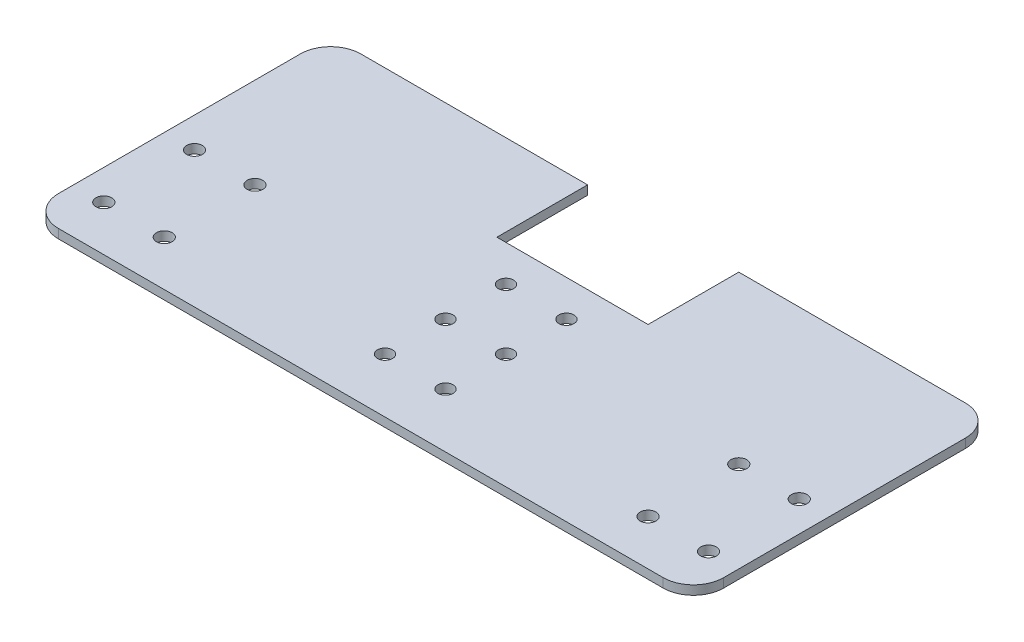
ISO-10303-21;
HEADER;
FILE_DESCRIPTION(('STEP AP214'),'2;1');
FILE_NAME('part.step','',(''),(''),'','','');
FILE_SCHEMA(('AUTOMOTIVE_DESIGN { 1 0 10303 214 1 1 1 1 }'));
ENDSEC;
DATA;
#1=APPLICATION_CONTEXT('core data for automotive mechanical design processes');
#2=APPLICATION_PROTOCOL_DEFINITION('international standard','automotive_design',2000,#1);
#3=PRODUCT_CONTEXT('',#1,'mechanical');
#4=PRODUCT('Part','Part','',(#3));
#5=PRODUCT_RELATED_PRODUCT_CATEGORY('part','',(#4));
#6=PRODUCT_DEFINITION_FORMATION('','',#4);
#7=PRODUCT_DEFINITION_CONTEXT('part definition',#1,'design');
#8=PRODUCT_DEFINITION('design','',#6,#7);
#9=PRODUCT_DEFINITION_SHAPE('','',#8);
#10=(LENGTH_UNIT() NAMED_UNIT(*) SI_UNIT(.MILLI.,.METRE.));
#11=(NAMED_UNIT(*) PLANE_ANGLE_UNIT() SI_UNIT($,.RADIAN.));
#12=(NAMED_UNIT(*) SI_UNIT($,.STERADIAN.) SOLID_ANGLE_UNIT());
#13=UNCERTAINTY_MEASURE_WITH_UNIT(LENGTH_MEASURE(1.E-05),#10,'distance_accuracy_value','');
#14=(GEOMETRIC_REPRESENTATION_CONTEXT(3) GLOBAL_UNCERTAINTY_ASSIGNED_CONTEXT((#13)) GLOBAL_UNIT_ASSIGNED_CONTEXT((#10,
#11,#12)) REPRESENTATION_CONTEXT('',''));
#15=CARTESIAN_POINT('',(0.,0.,0.));
#16=DIRECTION('',(0.,0.,1.));
#17=DIRECTION('',(1.,0.,0.));
#18=AXIS2_PLACEMENT_3D('',#15,#16,#17);
#19=CARTESIAN_POINT('',(-99.9999999999999,3.,-50.));
#20=DIRECTION('',(0.,0.,1.));
#21=DIRECTION('',(1.,0.,0.));
#22=AXIS2_PLACEMENT_3D('',#19,#20,#21);
#23=PLANE('',#22);
#24=DIRECTION('',(-1.,0.,0.));
#25=VECTOR('',#24,1.);
#26=CARTESIAN_POINT('',(-99.9999999999999,3.,-50.));
#27=LINE('',#26,#25);
#28=CARTESIAN_POINT('',(-25.,3.,-50.));
#29=VERTEX_POINT('',#28);
#30=CARTESIAN_POINT('',(-99.9999999999999,3.,-50.));
#31=VERTEX_POINT('',#30);
#32=EDGE_CURVE('E198',#29,#31,#27,.T.);
#33=ORIENTED_EDGE('',*,*,#32,.F.);
#34=DIRECTION('',(0.,1.,0.));
#35=VECTOR('',#34,1.);
#36=CARTESIAN_POINT('',(-25.,0.,-50.));
#37=LINE('',#36,#35);
#38=CARTESIAN_POINT('',(-25.,0.,-50.));
#39=VERTEX_POINT('',#38);
#40=EDGE_CURVE('E148',#39,#29,#37,.T.);
#41=ORIENTED_EDGE('',*,*,#40,.F.);
#42=DIRECTION('',(-1.,0.,0.));
#43=VECTOR('',#42,1.);
#44=CARTESIAN_POINT('',(-99.9999999999999,0.,-50.));
#45=LINE('',#44,#43);
#46=CARTESIAN_POINT('',(-99.9999999999999,0.,-50.));
#47=VERTEX_POINT('',#46);
#48=EDGE_CURVE('E147',#39,#47,#45,.T.);
#49=ORIENTED_EDGE('',*,*,#48,.T.);
#50=DIRECTION('',(0.,-1.,0.));
#51=VECTOR('',#50,1.);
#52=CARTESIAN_POINT('',(-99.9999999999999,3.,-50.));
#53=LINE('',#52,#51);
#54=EDGE_CURVE('E41',#31,#47,#53,.T.);
#55=ORIENTED_EDGE('',*,*,#54,.F.);
#56=EDGE_LOOP('',(#33,#41,#49,#55));
#57=FACE_BOUND('',#56,.T.);
#58=ADVANCED_FACE('F33',(#57),#23,.F.);
#59=CARTESIAN_POINT('',(100.,3.,-40.));
#60=DIRECTION('',(0.,-1.,0.));
#61=DIRECTION('',(0.,0.,-1.));
#62=AXIS2_PLACEMENT_3D('',#59,#60,#61);
#63=CYLINDRICAL_SURFACE('',#62,9.99999999999999);
#64=CARTESIAN_POINT('',(100.,0.,-40.));
#65=DIRECTION('',(0.,1.,0.));
#66=DIRECTION('',(0.,0.,-1.));
#67=AXIS2_PLACEMENT_3D('',#64,#65,#66);
#68=CIRCLE('',#67,9.99999999999999);
#69=CARTESIAN_POINT('',(110.,0.,-39.9999999999999));
#70=VERTEX_POINT('',#69);
#71=CARTESIAN_POINT('',(99.9999999999999,0.,-50.));
#72=VERTEX_POINT('',#71);
#73=EDGE_CURVE('E144',#70,#72,#68,.T.);
#74=ORIENTED_EDGE('',*,*,#73,.T.);
#75=DIRECTION('',(0.,-1.,0.));
#76=VECTOR('',#75,1.);
#77=CARTESIAN_POINT('',(99.9999999999999,3.,-50.));
#78=LINE('',#77,#76);
#79=CARTESIAN_POINT('',(99.9999999999999,3.,-50.));
#80=VERTEX_POINT('',#79);
#81=EDGE_CURVE('E11',#80,#72,#78,.T.);
#82=ORIENTED_EDGE('',*,*,#81,.F.);
#83=CARTESIAN_POINT('',(100.,3.,-40.));
#84=DIRECTION('',(0.,1.,0.));
#85=DIRECTION('',(0.,0.,-1.));
#86=AXIS2_PLACEMENT_3D('',#83,#84,#85);
#87=CIRCLE('',#86,9.99999999999999);
#88=CARTESIAN_POINT('',(110.,3.,-39.9999999999999));
#89=VERTEX_POINT('',#88);
#90=EDGE_CURVE('E162',#89,#80,#87,.T.);
#91=ORIENTED_EDGE('',*,*,#90,.F.);
#92=DIRECTION('',(0.,-1.,0.));
#93=VECTOR('',#92,1.);
#94=CARTESIAN_POINT('',(110.,3.,-39.9999999999999));
#95=LINE('',#94,#93);
#96=EDGE_CURVE('E140',#89,#70,#95,.T.);
#97=ORIENTED_EDGE('',*,*,#96,.T.);
#98=EDGE_LOOP('',(#74,#82,#91,#97));
#99=FACE_BOUND('',#98,.T.);
#100=ADVANCED_FACE('F35',(#99),#63,.T.);
#101=CARTESIAN_POINT('',(25.,0.,-50.));
#102=VERTEX_POINT('',#101);
#103=EDGE_CURVE('E149',#72,#102,#45,.T.);
#104=ORIENTED_EDGE('',*,*,#103,.T.);
#105=DIRECTION('',(0.,1.,0.));
#106=VECTOR('',#105,1.);
#107=CARTESIAN_POINT('',(25.,0.,-50.));
#108=LINE('',#107,#106);
#109=CARTESIAN_POINT('',(25.,3.,-50.));
#110=VERTEX_POINT('',#109);
#111=EDGE_CURVE('E205',#102,#110,#108,.T.);
#112=ORIENTED_EDGE('',*,*,#111,.T.);
#113=EDGE_CURVE('E98',#80,#110,#27,.T.);
#114=ORIENTED_EDGE('',*,*,#113,.F.);
#115=ORIENTED_EDGE('',*,*,#81,.T.);
#116=EDGE_LOOP('',(#104,#112,#114,#115));
#117=FACE_BOUND('',#116,.T.);
#118=ADVANCED_FACE('F362',(#117),#23,.F.);
#119=CARTESIAN_POINT('',(-100.,3.,-40.));
#120=DIRECTION('',(0.,-1.,0.));
#121=DIRECTION('',(0.,0.,-1.));
#122=AXIS2_PLACEMENT_3D('',#119,#120,#121);
#123=CYLINDRICAL_SURFACE('',#122,10.);
#124=CARTESIAN_POINT('',(-100.,0.,-40.));
#125=DIRECTION('',(0.,1.,0.));
#126=DIRECTION('',(0.,0.,-1.));
#127=AXIS2_PLACEMENT_3D('',#124,#125,#126);
#128=CIRCLE('',#127,10.);
#129=CARTESIAN_POINT('',(-110.,0.,-39.9999999999999));
#130=VERTEX_POINT('',#129);
#131=EDGE_CURVE('E152',#47,#130,#128,.T.);
#132=ORIENTED_EDGE('',*,*,#131,.T.);
#133=DIRECTION('',(0.,-1.,0.));
#134=VECTOR('',#133,1.);
#135=CARTESIAN_POINT('',(-110.,3.,-39.9999999999999));
#136=LINE('',#135,#134);
#137=CARTESIAN_POINT('',(-110.,3.,-39.9999999999999));
#138=VERTEX_POINT('',#137);
#139=EDGE_CURVE('E169',#138,#130,#136,.T.);
#140=ORIENTED_EDGE('',*,*,#139,.F.);
#141=CARTESIAN_POINT('',(-100.,3.,-40.));
#142=DIRECTION('',(0.,1.,0.));
#143=DIRECTION('',(0.,0.,-1.));
#144=AXIS2_PLACEMENT_3D('',#141,#142,#143);
#145=CIRCLE('',#144,10.);
#146=EDGE_CURVE('E178',#31,#138,#145,.T.);
#147=ORIENTED_EDGE('',*,*,#146,.F.);
#148=ORIENTED_EDGE('',*,*,#54,.T.);
#149=EDGE_LOOP('',(#132,#140,#147,#148));
#150=FACE_BOUND('',#149,.T.);
#151=ADVANCED_FACE('F176',(#150),#123,.T.);
#152=CARTESIAN_POINT('',(-110.,3.,-39.9999999999999));
#153=DIRECTION('',(1.,0.,0.));
#154=DIRECTION('',(0.,0.,-1.));
#155=AXIS2_PLACEMENT_3D('',#152,#153,#154);
#156=PLANE('',#155);
#157=DIRECTION('',(0.,0.,1.));
#158=VECTOR('',#157,1.);
#159=CARTESIAN_POINT('',(-110.,0.,-39.9999999999999));
#160=LINE('',#159,#158);
#161=CARTESIAN_POINT('',(-110.,0.,39.9999999999999));
#162=VERTEX_POINT('',#161);
#163=EDGE_CURVE('E154',#130,#162,#160,.T.);
#164=ORIENTED_EDGE('',*,*,#163,.T.);
#165=DIRECTION('',(0.,-1.,0.));
#166=VECTOR('',#165,1.);
#167=CARTESIAN_POINT('',(-110.,3.,39.9999999999999));
#168=LINE('',#167,#166);
#169=CARTESIAN_POINT('',(-110.,3.,39.9999999999999));
#170=VERTEX_POINT('',#169);
#171=EDGE_CURVE('E166',#170,#162,#168,.T.);
#172=ORIENTED_EDGE('',*,*,#171,.F.);
#173=DIRECTION('',(0.,0.,1.));
#174=VECTOR('',#173,1.);
#175=CARTESIAN_POINT('',(-110.,3.,-39.9999999999999));
#176=LINE('',#175,#174);
#177=EDGE_CURVE('E193',#138,#170,#176,.T.);
#178=ORIENTED_EDGE('',*,*,#177,.F.);
#179=ORIENTED_EDGE('',*,*,#139,.T.);
#180=EDGE_LOOP('',(#164,#172,#178,#179));
#181=FACE_BOUND('',#180,.T.);
#182=ADVANCED_FACE('F189',(#181),#156,.F.);
#183=CARTESIAN_POINT('',(-100.,3.,40.));
#184=DIRECTION('',(0.,-1.,0.));
#185=DIRECTION('',(0.,0.,-1.));
#186=AXIS2_PLACEMENT_3D('',#183,#184,#185);
#187=CYLINDRICAL_SURFACE('',#186,10.);
#188=CARTESIAN_POINT('',(-100.,0.,40.));
#189=DIRECTION('',(0.,1.,0.));
#190=DIRECTION('',(0.,0.,-1.));
#191=AXIS2_PLACEMENT_3D('',#188,#189,#190);
#192=CIRCLE('',#191,10.);
#193=CARTESIAN_POINT('',(-99.9999999999999,0.,50.));
#194=VERTEX_POINT('',#193);
#195=EDGE_CURVE('E156',#162,#194,#192,.T.);
#196=ORIENTED_EDGE('',*,*,#195,.T.);
#197=DIRECTION('',(0.,-1.,0.));
#198=VECTOR('',#197,1.);
#199=CARTESIAN_POINT('',(-99.9999999999999,3.,50.));
#200=LINE('',#199,#198);
#201=CARTESIAN_POINT('',(-99.9999999999999,3.,50.));
#202=VERTEX_POINT('',#201);
#203=EDGE_CURVE('E135',#202,#194,#200,.T.);
#204=ORIENTED_EDGE('',*,*,#203,.F.);
#205=CARTESIAN_POINT('',(-100.,3.,40.));
#206=DIRECTION('',(0.,1.,0.));
#207=DIRECTION('',(0.,0.,-1.));
#208=AXIS2_PLACEMENT_3D('',#205,#206,#207);
#209=CIRCLE('',#208,10.);
#210=EDGE_CURVE('E123',#170,#202,#209,.T.);
#211=ORIENTED_EDGE('',*,*,#210,.F.);
#212=ORIENTED_EDGE('',*,*,#171,.T.);
#213=EDGE_LOOP('',(#196,#204,#211,#212));
#214=FACE_BOUND('',#213,.T.);
#215=ADVANCED_FACE('F192',(#214),#187,.T.);
#216=CARTESIAN_POINT('',(-99.9999999999999,3.,50.));
#217=DIRECTION('',(0.,0.,-1.));
#218=DIRECTION('',(-1.,0.,0.));
#219=AXIS2_PLACEMENT_3D('',#216,#217,#218);
#220=PLANE('',#219);
#221=DIRECTION('',(1.,0.,0.));
#222=VECTOR('',#221,1.);
#223=CARTESIAN_POINT('',(-99.9999999999999,0.,50.));
#224=LINE('',#223,#222);
#225=CARTESIAN_POINT('',(99.9999999999999,0.,50.));
#226=VERTEX_POINT('',#225);
#227=EDGE_CURVE('E132',#194,#226,#224,.T.);
#228=ORIENTED_EDGE('',*,*,#227,.T.);
#229=DIRECTION('',(0.,-1.,0.));
#230=VECTOR('',#229,1.);
#231=CARTESIAN_POINT('',(99.9999999999999,3.,50.));
#232=LINE('',#231,#230);
#233=CARTESIAN_POINT('',(99.9999999999999,3.,50.));
#234=VERTEX_POINT('',#233);
#235=EDGE_CURVE('E129',#234,#226,#232,.T.);
#236=ORIENTED_EDGE('',*,*,#235,.F.);
#237=DIRECTION('',(1.,0.,0.));
#238=VECTOR('',#237,1.);
#239=CARTESIAN_POINT('',(-99.9999999999999,3.,50.));
#240=LINE('',#239,#238);
#241=EDGE_CURVE('E115',#202,#234,#240,.T.);
#242=ORIENTED_EDGE('',*,*,#241,.F.);
#243=ORIENTED_EDGE('',*,*,#203,.T.);
#244=EDGE_LOOP('',(#228,#236,#242,#243));
#245=FACE_BOUND('',#244,.T.);
#246=ADVANCED_FACE('F130',(#245),#220,.F.);
#247=CARTESIAN_POINT('',(100.,3.,40.));
#248=DIRECTION('',(0.,-1.,0.));
#249=DIRECTION('',(0.,0.,-1.));
#250=AXIS2_PLACEMENT_3D('',#247,#248,#249);
#251=CYLINDRICAL_SURFACE('',#250,9.99999999999999);
#252=CARTESIAN_POINT('',(100.,0.,40.));
#253=DIRECTION('',(0.,1.,0.));
#254=DIRECTION('',(0.,0.,-1.));
#255=AXIS2_PLACEMENT_3D('',#252,#253,#254);
#256=CIRCLE('',#255,9.99999999999999);
#257=CARTESIAN_POINT('',(110.,0.,39.9999999999999));
#258=VERTEX_POINT('',#257);
#259=EDGE_CURVE('E159',#226,#258,#256,.T.);
#260=ORIENTED_EDGE('',*,*,#259,.T.);
#261=DIRECTION('',(0.,-1.,0.));
#262=VECTOR('',#261,1.);
#263=CARTESIAN_POINT('',(110.,3.,39.9999999999999));
#264=LINE('',#263,#262);
#265=CARTESIAN_POINT('',(110.,3.,39.9999999999999));
#266=VERTEX_POINT('',#265);
#267=EDGE_CURVE('E136',#266,#258,#264,.T.);
#268=ORIENTED_EDGE('',*,*,#267,.F.);
#269=CARTESIAN_POINT('',(100.,3.,40.));
#270=DIRECTION('',(0.,1.,0.));
#271=DIRECTION('',(0.,0.,-1.));
#272=AXIS2_PLACEMENT_3D('',#269,#270,#271);
#273=CIRCLE('',#272,9.99999999999999);
#274=EDGE_CURVE('E120',#234,#266,#273,.T.);
#275=ORIENTED_EDGE('',*,*,#274,.F.);
#276=ORIENTED_EDGE('',*,*,#235,.T.);
#277=EDGE_LOOP('',(#260,#268,#275,#276));
#278=FACE_BOUND('',#277,.T.);
#279=ADVANCED_FACE('F138',(#278),#251,.T.);
#280=CARTESIAN_POINT('',(110.,3.,-39.9999999999999));
#281=DIRECTION('',(-1.,0.,0.));
#282=DIRECTION('',(0.,0.,1.));
#283=AXIS2_PLACEMENT_3D('',#280,#281,#282);
#284=PLANE('',#283);
#285=DIRECTION('',(0.,0.,-1.));
#286=VECTOR('',#285,1.);
#287=CARTESIAN_POINT('',(110.,0.,-39.9999999999999));
#288=LINE('',#287,#286);
#289=EDGE_CURVE('E90',#258,#70,#288,.T.);
#290=ORIENTED_EDGE('',*,*,#289,.T.);
#291=ORIENTED_EDGE('',*,*,#96,.F.);
#292=DIRECTION('',(0.,0.,-1.));
#293=VECTOR('',#292,1.);
#294=CARTESIAN_POINT('',(110.,3.,-39.9999999999999));
#295=LINE('',#294,#293);
#296=EDGE_CURVE('E57',#266,#89,#295,.T.);
#297=ORIENTED_EDGE('',*,*,#296,.F.);
#298=ORIENTED_EDGE('',*,*,#267,.T.);
#299=EDGE_LOOP('',(#290,#291,#297,#298));
#300=FACE_BOUND('',#299,.T.);
#301=ADVANCED_FACE('F321',(#300),#284,.F.);
#302=CARTESIAN_POINT('',(100.,3.,-40.));
#303=DIRECTION('',(0.,-1.,0.));
#304=DIRECTION('',(0.,0.,-1.));
#305=AXIS2_PLACEMENT_3D('',#302,#303,#304);
#306=PLANE('',#305);
#307=CARTESIAN_POINT('',(-100.,3.,35.));
#308=DIRECTION('',(0.,1.,0.));
#309=DIRECTION('',(0.,0.,1.));
#310=AXIS2_PLACEMENT_3D('',#307,#308,#309);
#311=CIRCLE('',#310,2.6);
#312=CARTESIAN_POINT('',(-100.,3.,37.6));
#313=VERTEX_POINT('',#312);
#314=EDGE_CURVE('E279',#313,#313,#311,.T.);
#315=ORIENTED_EDGE('',*,*,#314,.F.);
#316=EDGE_LOOP('',(#315));
#317=FACE_BOUND('',#316,.T.);
#318=CARTESIAN_POINT('',(80.,3.,5.));
#319=DIRECTION('',(0.,1.,0.));
#320=DIRECTION('',(0.,0.,1.));
#321=AXIS2_PLACEMENT_3D('',#318,#319,#320);
#322=CIRCLE('',#321,2.6);
#323=CARTESIAN_POINT('',(80.,3.,7.6));
#324=VERTEX_POINT('',#323);
#325=EDGE_CURVE('E286',#324,#324,#322,.T.);
#326=ORIENTED_EDGE('',*,*,#325,.F.);
#327=EDGE_LOOP('',(#326));
#328=FACE_BOUND('',#327,.T.);
#329=CARTESIAN_POINT('',(100.,3.,5.));
#330=DIRECTION('',(0.,1.,0.));
#331=DIRECTION('',(0.,0.,1.));
#332=AXIS2_PLACEMENT_3D('',#329,#330,#331);
#333=CIRCLE('',#332,2.6);
#334=CARTESIAN_POINT('',(100.,3.,7.6));
#335=VERTEX_POINT('',#334);
#336=EDGE_CURVE('E267',#335,#335,#333,.T.);
#337=ORIENTED_EDGE('',*,*,#336,.F.);
#338=EDGE_LOOP('',(#337));
#339=FACE_BOUND('',#338,.T.);
#340=CARTESIAN_POINT('',(80.,3.,35.));
#341=DIRECTION('',(0.,1.,0.));
#342=DIRECTION('',(0.,0.,1.));
#343=AXIS2_PLACEMENT_3D('',#340,#341,#342);
#344=CIRCLE('',#343,2.6);
#345=CARTESIAN_POINT('',(80.,3.,37.6));
#346=VERTEX_POINT('',#345);
#347=EDGE_CURVE('E274',#346,#346,#344,.T.);
#348=ORIENTED_EDGE('',*,*,#347,.F.);
#349=EDGE_LOOP('',(#348));
#350=FACE_BOUND('',#349,.T.);
#351=CARTESIAN_POINT('',(-80.,3.,5.));
#352=DIRECTION('',(0.,1.,0.));
#353=DIRECTION('',(0.,0.,1.));
#354=AXIS2_PLACEMENT_3D('',#351,#352,#353);
#355=CIRCLE('',#354,2.6);
#356=CARTESIAN_POINT('',(-80.,3.,7.6));
#357=VERTEX_POINT('',#356);
#358=EDGE_CURVE('E303',#357,#357,#355,.T.);
#359=ORIENTED_EDGE('',*,*,#358,.F.);
#360=EDGE_LOOP('',(#359));
#361=FACE_BOUND('',#360,.T.);
#362=CARTESIAN_POINT('',(-80.,3.,35.));
#363=DIRECTION('',(0.,1.,0.));
#364=DIRECTION('',(0.,0.,1.));
#365=AXIS2_PLACEMENT_3D('',#362,#363,#364);
#366=CIRCLE('',#365,2.6);
#367=CARTESIAN_POINT('',(-80.,3.,37.6));
#368=VERTEX_POINT('',#367);
#369=EDGE_CURVE('E291',#368,#368,#366,.T.);
#370=ORIENTED_EDGE('',*,*,#369,.F.);
#371=EDGE_LOOP('',(#370));
#372=FACE_BOUND('',#371,.T.);
#373=CARTESIAN_POINT('',(-100.,3.,5.));
#374=DIRECTION('',(0.,1.,0.));
#375=DIRECTION('',(0.,0.,1.));
#376=AXIS2_PLACEMENT_3D('',#373,#374,#375);
#377=CIRCLE('',#376,2.6);
#378=CARTESIAN_POINT('',(-100.,3.,7.6));
#379=VERTEX_POINT('',#378);
#380=EDGE_CURVE('E298',#379,#379,#377,.T.);
#381=ORIENTED_EDGE('',*,*,#380,.F.);
#382=EDGE_LOOP('',(#381));
#383=FACE_BOUND('',#382,.T.);
#384=CARTESIAN_POINT('',(100.,3.,35.));
#385=DIRECTION('',(0.,1.,0.));
#386=DIRECTION('',(0.,0.,1.));
#387=AXIS2_PLACEMENT_3D('',#384,#385,#386);
#388=CIRCLE('',#387,2.6);
#389=CARTESIAN_POINT('',(100.,3.,37.6));
#390=VERTEX_POINT('',#389);
#391=EDGE_CURVE('E261',#390,#390,#388,.T.);
#392=ORIENTED_EDGE('',*,*,#391,.F.);
#393=EDGE_LOOP('',(#392));
#394=FACE_BOUND('',#393,.T.);
#395=CARTESIAN_POINT('',(-10.0000000000001,3.,-8.));
#396=DIRECTION('',(0.,1.,0.));
#397=DIRECTION('',(0.,0.,1.));
#398=AXIS2_PLACEMENT_3D('',#395,#396,#397);
#399=CIRCLE('',#398,2.5);
#400=CARTESIAN_POINT('',(-10.0000000000001,3.,-5.5));
#401=VERTEX_POINT('',#400);
#402=EDGE_CURVE('E231',#401,#401,#399,.T.);
#403=ORIENTED_EDGE('',*,*,#402,.F.);
#404=EDGE_LOOP('',(#403));
#405=FACE_BOUND('',#404,.T.);
#406=CARTESIAN_POINT('',(-10.0000000000001,3.,12.));
#407=DIRECTION('',(0.,1.,0.));
#408=DIRECTION('',(0.,0.,1.));
#409=AXIS2_PLACEMENT_3D('',#406,#407,#408);
#410=CIRCLE('',#409,2.5);
#411=CARTESIAN_POINT('',(-10.0000000000001,3.,14.5));
#412=VERTEX_POINT('',#411);
#413=EDGE_CURVE('E238',#412,#412,#410,.T.);
#414=ORIENTED_EDGE('',*,*,#413,.F.);
#415=EDGE_LOOP('',(#414));
#416=FACE_BOUND('',#415,.T.);
#417=CARTESIAN_POINT('',(-10.,3.,32.));
#418=DIRECTION('',(0.,1.,0.));
#419=DIRECTION('',(0.,0.,1.));
#420=AXIS2_PLACEMENT_3D('',#417,#418,#419);
#421=CIRCLE('',#420,2.5);
#422=CARTESIAN_POINT('',(-10.,3.,34.5));
#423=VERTEX_POINT('',#422);
#424=EDGE_CURVE('E244',#423,#423,#421,.T.);
#425=ORIENTED_EDGE('',*,*,#424,.F.);
#426=EDGE_LOOP('',(#425));
#427=FACE_BOUND('',#426,.T.);
#428=CARTESIAN_POINT('',(10.0000000000004,3.,32.));
#429=DIRECTION('',(0.,1.,0.));
#430=DIRECTION('',(0.,0.,1.));
#431=AXIS2_PLACEMENT_3D('',#428,#429,#430);
#432=CIRCLE('',#431,2.5);
#433=CARTESIAN_POINT('',(10.0000000000004,3.,34.5));
#434=VERTEX_POINT('',#433);
#435=EDGE_CURVE('E250',#434,#434,#432,.T.);
#436=ORIENTED_EDGE('',*,*,#435,.F.);
#437=EDGE_LOOP('',(#436));
#438=FACE_BOUND('',#437,.T.);
#439=CARTESIAN_POINT('',(10.0000000000002,3.,12.));
#440=DIRECTION('',(0.,1.,0.));
#441=DIRECTION('',(0.,0.,1.));
#442=AXIS2_PLACEMENT_3D('',#439,#440,#441);
#443=CIRCLE('',#442,2.5);
#444=CARTESIAN_POINT('',(10.0000000000002,3.,14.5));
#445=VERTEX_POINT('',#444);
#446=EDGE_CURVE('E256',#445,#445,#443,.T.);
#447=ORIENTED_EDGE('',*,*,#446,.F.);
#448=EDGE_LOOP('',(#447));
#449=FACE_BOUND('',#448,.T.);
#450=CARTESIAN_POINT('',(10.,3.,-8.));
#451=DIRECTION('',(0.,1.,0.));
#452=DIRECTION('',(0.,0.,1.));
#453=AXIS2_PLACEMENT_3D('',#450,#451,#452);
#454=CIRCLE('',#453,2.5);
#455=CARTESIAN_POINT('',(10.,3.,-5.5));
#456=VERTEX_POINT('',#455);
#457=EDGE_CURVE('E225',#456,#456,#454,.T.);
#458=ORIENTED_EDGE('',*,*,#457,.F.);
#459=EDGE_LOOP('',(#458));
#460=FACE_BOUND('',#459,.T.);
#461=DIRECTION('',(1.,0.,0.));
#462=VECTOR('',#461,1.);
#463=CARTESIAN_POINT('',(-25.,3.,-20.));
#464=LINE('',#463,#462);
#465=CARTESIAN_POINT('',(-25.,3.,-20.));
#466=VERTEX_POINT('',#465);
#467=CARTESIAN_POINT('',(25.,3.,-20.));
#468=VERTEX_POINT('',#467);
#469=EDGE_CURVE('E213',#466,#468,#464,.T.);
#470=ORIENTED_EDGE('',*,*,#469,.F.);
#471=DIRECTION('',(0.,0.,1.));
#472=VECTOR('',#471,1.);
#473=CARTESIAN_POINT('',(-25.,3.,-50.));
#474=LINE('',#473,#472);
#475=EDGE_CURVE('E216',#29,#466,#474,.T.);
#476=ORIENTED_EDGE('',*,*,#475,.F.);
#477=ORIENTED_EDGE('',*,*,#32,.T.);
#478=ORIENTED_EDGE('',*,*,#146,.T.);
#479=ORIENTED_EDGE('',*,*,#177,.T.);
#480=ORIENTED_EDGE('',*,*,#210,.T.);
#481=ORIENTED_EDGE('',*,*,#241,.T.);
#482=ORIENTED_EDGE('',*,*,#274,.T.);
#483=ORIENTED_EDGE('',*,*,#296,.T.);
#484=ORIENTED_EDGE('',*,*,#90,.T.);
#485=ORIENTED_EDGE('',*,*,#113,.T.);
#486=DIRECTION('',(0.,0.,-1.));
#487=VECTOR('',#486,1.);
#488=CARTESIAN_POINT('',(25.,3.,-50.));
#489=LINE('',#488,#487);
#490=EDGE_CURVE('E209',#468,#110,#489,.T.);
#491=ORIENTED_EDGE('',*,*,#490,.F.);
#492=EDGE_LOOP('',(#470,#476,#477,#478,#479,#480,#481,#482,#483,#484,#485,#491));
#493=FACE_BOUND('',#492,.T.);
#494=ADVANCED_FACE('F118',(#317,#328,#339,#350,#361,#372,#383,#394,#405,#416,#427,#438,#449,
#460,#493),#306,.F.);
#495=CARTESIAN_POINT('',(100.,0.,-40.));
#496=DIRECTION('',(0.,-1.,0.));
#497=DIRECTION('',(0.,0.,-1.));
#498=AXIS2_PLACEMENT_3D('',#495,#496,#497);
#499=PLANE('',#498);
#500=CARTESIAN_POINT('',(-100.,0.,35.));
#501=DIRECTION('',(0.,1.,0.));
#502=DIRECTION('',(0.,0.,1.));
#503=AXIS2_PLACEMENT_3D('',#500,#501,#502);
#504=CIRCLE('',#503,2.6);
#505=CARTESIAN_POINT('',(-100.,0.,37.6));
#506=VERTEX_POINT('',#505);
#507=EDGE_CURVE('E282',#506,#506,#504,.T.);
#508=ORIENTED_EDGE('',*,*,#507,.T.);
#509=EDGE_LOOP('',(#508));
#510=FACE_BOUND('',#509,.T.);
#511=CARTESIAN_POINT('',(80.,0.,5.));
#512=DIRECTION('',(0.,1.,0.));
#513=DIRECTION('',(0.,0.,1.));
#514=AXIS2_PLACEMENT_3D('',#511,#512,#513);
#515=CIRCLE('',#514,2.6);
#516=CARTESIAN_POINT('',(80.,0.,7.6));
#517=VERTEX_POINT('',#516);
#518=EDGE_CURVE('E271',#517,#517,#515,.T.);
#519=ORIENTED_EDGE('',*,*,#518,.T.);
#520=EDGE_LOOP('',(#519));
#521=FACE_BOUND('',#520,.T.);
#522=CARTESIAN_POINT('',(100.,0.,5.));
#523=DIRECTION('',(0.,1.,0.));
#524=DIRECTION('',(0.,0.,1.));
#525=AXIS2_PLACEMENT_3D('',#522,#523,#524);
#526=CIRCLE('',#525,2.6);
#527=CARTESIAN_POINT('',(100.,0.,7.6));
#528=VERTEX_POINT('',#527);
#529=EDGE_CURVE('E270',#528,#528,#526,.T.);
#530=ORIENTED_EDGE('',*,*,#529,.T.);
#531=EDGE_LOOP('',(#530));
#532=FACE_BOUND('',#531,.T.);
#533=CARTESIAN_POINT('',(80.,0.,35.));
#534=DIRECTION('',(0.,1.,0.));
#535=DIRECTION('',(0.,0.,1.));
#536=AXIS2_PLACEMENT_3D('',#533,#534,#535);
#537=CIRCLE('',#536,2.6);
#538=CARTESIAN_POINT('',(80.,0.,37.6));
#539=VERTEX_POINT('',#538);
#540=EDGE_CURVE('E264',#539,#539,#537,.T.);
#541=ORIENTED_EDGE('',*,*,#540,.T.);
#542=EDGE_LOOP('',(#541));
#543=FACE_BOUND('',#542,.T.);
#544=CARTESIAN_POINT('',(-80.,0.,5.));
#545=DIRECTION('',(0.,1.,0.));
#546=DIRECTION('',(0.,0.,1.));
#547=AXIS2_PLACEMENT_3D('',#544,#545,#546);
#548=CIRCLE('',#547,2.6);
#549=CARTESIAN_POINT('',(-80.,0.,7.6));
#550=VERTEX_POINT('',#549);
#551=EDGE_CURVE('E295',#550,#550,#548,.T.);
#552=ORIENTED_EDGE('',*,*,#551,.T.);
#553=EDGE_LOOP('',(#552));
#554=FACE_BOUND('',#553,.T.);
#555=CARTESIAN_POINT('',(-80.,0.,35.));
#556=DIRECTION('',(0.,1.,0.));
#557=DIRECTION('',(0.,0.,1.));
#558=AXIS2_PLACEMENT_3D('',#555,#556,#557);
#559=CIRCLE('',#558,2.6);
#560=CARTESIAN_POINT('',(-80.,0.,37.6));
#561=VERTEX_POINT('',#560);
#562=EDGE_CURVE('E294',#561,#561,#559,.T.);
#563=ORIENTED_EDGE('',*,*,#562,.T.);
#564=EDGE_LOOP('',(#563));
#565=FACE_BOUND('',#564,.T.);
#566=CARTESIAN_POINT('',(-100.,0.,5.));
#567=DIRECTION('',(0.,1.,0.));
#568=DIRECTION('',(0.,0.,1.));
#569=AXIS2_PLACEMENT_3D('',#566,#567,#568);
#570=CIRCLE('',#569,2.6);
#571=CARTESIAN_POINT('',(-100.,0.,7.6));
#572=VERTEX_POINT('',#571);
#573=EDGE_CURVE('E283',#572,#572,#570,.T.);
#574=ORIENTED_EDGE('',*,*,#573,.T.);
#575=EDGE_LOOP('',(#574));
#576=FACE_BOUND('',#575,.T.);
#577=CARTESIAN_POINT('',(100.,0.,35.));
#578=DIRECTION('',(0.,1.,0.));
#579=DIRECTION('',(0.,0.,1.));
#580=AXIS2_PLACEMENT_3D('',#577,#578,#579);
#581=CIRCLE('',#580,2.6);
#582=CARTESIAN_POINT('',(100.,0.,37.6));
#583=VERTEX_POINT('',#582);
#584=EDGE_CURVE('E235',#583,#583,#581,.T.);
#585=ORIENTED_EDGE('',*,*,#584,.T.);
#586=EDGE_LOOP('',(#585));
#587=FACE_BOUND('',#586,.T.);
#588=CARTESIAN_POINT('',(-10.0000000000001,0.,-8.));
#589=DIRECTION('',(0.,1.,0.));
#590=DIRECTION('',(0.,0.,1.));
#591=AXIS2_PLACEMENT_3D('',#588,#589,#590);
#592=CIRCLE('',#591,2.5);
#593=CARTESIAN_POINT('',(-10.0000000000001,0.,-5.5));
#594=VERTEX_POINT('',#593);
#595=EDGE_CURVE('E234',#594,#594,#592,.T.);
#596=ORIENTED_EDGE('',*,*,#595,.T.);
#597=EDGE_LOOP('',(#596));
#598=FACE_BOUND('',#597,.T.);
#599=CARTESIAN_POINT('',(-10.0000000000001,0.,12.));
#600=DIRECTION('',(0.,1.,0.));
#601=DIRECTION('',(0.,0.,1.));
#602=AXIS2_PLACEMENT_3D('',#599,#600,#601);
#603=CIRCLE('',#602,2.5);
#604=CARTESIAN_POINT('',(-10.0000000000001,0.,14.5));
#605=VERTEX_POINT('',#604);
#606=EDGE_CURVE('E241',#605,#605,#603,.T.);
#607=ORIENTED_EDGE('',*,*,#606,.T.);
#608=EDGE_LOOP('',(#607));
#609=FACE_BOUND('',#608,.T.);
#610=CARTESIAN_POINT('',(-10.,0.,32.));
#611=DIRECTION('',(0.,1.,0.));
#612=DIRECTION('',(0.,0.,1.));
#613=AXIS2_PLACEMENT_3D('',#610,#611,#612);
#614=CIRCLE('',#613,2.5);
#615=CARTESIAN_POINT('',(-10.,0.,34.5));
#616=VERTEX_POINT('',#615);
#617=EDGE_CURVE('E247',#616,#616,#614,.T.);
#618=ORIENTED_EDGE('',*,*,#617,.T.);
#619=EDGE_LOOP('',(#618));
#620=FACE_BOUND('',#619,.T.);
#621=CARTESIAN_POINT('',(10.0000000000004,0.,32.));
#622=DIRECTION('',(0.,1.,0.));
#623=DIRECTION('',(0.,0.,1.));
#624=AXIS2_PLACEMENT_3D('',#621,#622,#623);
#625=CIRCLE('',#624,2.5);
#626=CARTESIAN_POINT('',(10.0000000000004,0.,34.5));
#627=VERTEX_POINT('',#626);
#628=EDGE_CURVE('E253',#627,#627,#625,.T.);
#629=ORIENTED_EDGE('',*,*,#628,.T.);
#630=EDGE_LOOP('',(#629));
#631=FACE_BOUND('',#630,.T.);
#632=CARTESIAN_POINT('',(10.0000000000002,0.,12.));
#633=DIRECTION('',(0.,1.,0.));
#634=DIRECTION('',(0.,0.,1.));
#635=AXIS2_PLACEMENT_3D('',#632,#633,#634);
#636=CIRCLE('',#635,2.5);
#637=CARTESIAN_POINT('',(10.0000000000002,0.,14.5));
#638=VERTEX_POINT('',#637);
#639=EDGE_CURVE('E228',#638,#638,#636,.T.);
#640=ORIENTED_EDGE('',*,*,#639,.T.);
#641=EDGE_LOOP('',(#640));
#642=FACE_BOUND('',#641,.T.);
#643=CARTESIAN_POINT('',(10.,0.,-8.));
#644=DIRECTION('',(0.,1.,0.));
#645=DIRECTION('',(0.,0.,1.));
#646=AXIS2_PLACEMENT_3D('',#643,#644,#645);
#647=CIRCLE('',#646,2.5);
#648=CARTESIAN_POINT('',(10.,0.,-5.5));
#649=VERTEX_POINT('',#648);
#650=EDGE_CURVE('E219',#649,#649,#647,.T.);
#651=ORIENTED_EDGE('',*,*,#650,.T.);
#652=EDGE_LOOP('',(#651));
#653=FACE_BOUND('',#652,.T.);
#654=DIRECTION('',(0.,0.,1.));
#655=VECTOR('',#654,1.);
#656=CARTESIAN_POINT('',(-25.,0.,-50.));
#657=LINE('',#656,#655);
#658=CARTESIAN_POINT('',(-25.,0.,-20.));
#659=VERTEX_POINT('',#658);
#660=EDGE_CURVE('E212',#39,#659,#657,.T.);
#661=ORIENTED_EDGE('',*,*,#660,.T.);
#662=DIRECTION('',(1.,0.,0.));
#663=VECTOR('',#662,1.);
#664=CARTESIAN_POINT('',(-25.,0.,-20.));
#665=LINE('',#664,#663);
#666=CARTESIAN_POINT('',(25.,0.,-20.));
#667=VERTEX_POINT('',#666);
#668=EDGE_CURVE('E221',#659,#667,#665,.T.);
#669=ORIENTED_EDGE('',*,*,#668,.T.);
#670=DIRECTION('',(0.,0.,-1.));
#671=VECTOR('',#670,1.);
#672=CARTESIAN_POINT('',(25.,0.,-50.));
#673=LINE('',#672,#671);
#674=EDGE_CURVE('E48',#667,#102,#673,.T.);
#675=ORIENTED_EDGE('',*,*,#674,.T.);
#676=ORIENTED_EDGE('',*,*,#103,.F.);
#677=ORIENTED_EDGE('',*,*,#73,.F.);
#678=ORIENTED_EDGE('',*,*,#289,.F.);
#679=ORIENTED_EDGE('',*,*,#259,.F.);
#680=ORIENTED_EDGE('',*,*,#227,.F.);
#681=ORIENTED_EDGE('',*,*,#195,.F.);
#682=ORIENTED_EDGE('',*,*,#163,.F.);
#683=ORIENTED_EDGE('',*,*,#131,.F.);
#684=ORIENTED_EDGE('',*,*,#48,.F.);
#685=EDGE_LOOP('',(#661,#669,#675,#676,#677,#678,#679,#680,#681,#682,#683,#684));
#686=FACE_BOUND('',#685,.T.);
#687=ADVANCED_FACE('F185',(#510,#521,#532,#543,#554,#565,#576,#587,#598,#609,#620,#631,#642,
#653,#686),#499,.T.);
#688=CARTESIAN_POINT('',(-25.,0.,-50.));
#689=DIRECTION('',(-1.,0.,0.));
#690=DIRECTION('',(0.,0.,1.));
#691=AXIS2_PLACEMENT_3D('',#688,#689,#690);
#692=PLANE('',#691);
#693=ORIENTED_EDGE('',*,*,#475,.T.);
#694=DIRECTION('',(0.,1.,0.));
#695=VECTOR('',#694,1.);
#696=CARTESIAN_POINT('',(-25.,0.,-20.));
#697=LINE('',#696,#695);
#698=EDGE_CURVE('E200',#659,#466,#697,.T.);
#699=ORIENTED_EDGE('',*,*,#698,.F.);
#700=ORIENTED_EDGE('',*,*,#660,.F.);
#701=ORIENTED_EDGE('',*,*,#40,.T.);
#702=EDGE_LOOP('',(#693,#699,#700,#701));
#703=FACE_BOUND('',#702,.T.);
#704=ADVANCED_FACE('F442',(#703),#692,.F.);
#705=CARTESIAN_POINT('',(25.,0.,-50.));
#706=DIRECTION('',(1.,0.,0.));
#707=DIRECTION('',(0.,0.,-1.));
#708=AXIS2_PLACEMENT_3D('',#705,#706,#707);
#709=PLANE('',#708);
#710=ORIENTED_EDGE('',*,*,#490,.T.);
#711=ORIENTED_EDGE('',*,*,#111,.F.);
#712=ORIENTED_EDGE('',*,*,#674,.F.);
#713=DIRECTION('',(0.,1.,0.));
#714=VECTOR('',#713,1.);
#715=CARTESIAN_POINT('',(25.,0.,-20.));
#716=LINE('',#715,#714);
#717=EDGE_CURVE('E203',#667,#468,#716,.T.);
#718=ORIENTED_EDGE('',*,*,#717,.T.);
#719=EDGE_LOOP('',(#710,#711,#712,#718));
#720=FACE_BOUND('',#719,.T.);
#721=ADVANCED_FACE('F355',(#720),#709,.F.);
#722=CARTESIAN_POINT('',(-25.,0.,-20.));
#723=DIRECTION('',(0.,0.,1.));
#724=DIRECTION('',(1.,0.,0.));
#725=AXIS2_PLACEMENT_3D('',#722,#723,#724);
#726=PLANE('',#725);
#727=ORIENTED_EDGE('',*,*,#469,.T.);
#728=ORIENTED_EDGE('',*,*,#717,.F.);
#729=ORIENTED_EDGE('',*,*,#668,.F.);
#730=ORIENTED_EDGE('',*,*,#698,.T.);
#731=EDGE_LOOP('',(#727,#728,#729,#730));
#732=FACE_BOUND('',#731,.T.);
#733=ADVANCED_FACE('F345',(#732),#726,.F.);
#734=CARTESIAN_POINT('',(10.,0.,-8.));
#735=DIRECTION('',(0.,1.,0.));
#736=DIRECTION('',(0.,0.,1.));
#737=AXIS2_PLACEMENT_3D('',#734,#735,#736);
#738=CYLINDRICAL_SURFACE('',#737,2.5);
#739=ORIENTED_EDGE('',*,*,#650,.F.);
#740=EDGE_LOOP('',(#739));
#741=FACE_BOUND('',#740,.T.);
#742=ORIENTED_EDGE('',*,*,#457,.T.);
#743=EDGE_LOOP('',(#742));
#744=FACE_BOUND('',#743,.T.);
#745=ADVANCED_FACE('F342',(#741,#744),#738,.F.);
#746=CARTESIAN_POINT('',(10.0000000000002,0.,12.));
#747=DIRECTION('',(0.,1.,0.));
#748=DIRECTION('',(0.,0.,1.));
#749=AXIS2_PLACEMENT_3D('',#746,#747,#748);
#750=CYLINDRICAL_SURFACE('',#749,2.5);
#751=ORIENTED_EDGE('',*,*,#639,.F.);
#752=EDGE_LOOP('',(#751));
#753=FACE_BOUND('',#752,.T.);
#754=ORIENTED_EDGE('',*,*,#446,.T.);
#755=EDGE_LOOP('',(#754));
#756=FACE_BOUND('',#755,.T.);
#757=ADVANCED_FACE('F344',(#753,#756),#750,.F.);
#758=CARTESIAN_POINT('',(10.0000000000004,0.,32.));
#759=DIRECTION('',(0.,1.,0.));
#760=DIRECTION('',(0.,0.,1.));
#761=AXIS2_PLACEMENT_3D('',#758,#759,#760);
#762=CYLINDRICAL_SURFACE('',#761,2.5);
#763=ORIENTED_EDGE('',*,*,#628,.F.);
#764=EDGE_LOOP('',(#763));
#765=FACE_BOUND('',#764,.T.);
#766=ORIENTED_EDGE('',*,*,#435,.T.);
#767=EDGE_LOOP('',(#766));
#768=FACE_BOUND('',#767,.T.);
#769=ADVANCED_FACE('F352',(#765,#768),#762,.F.);
#770=CARTESIAN_POINT('',(-10.,0.,32.));
#771=DIRECTION('',(0.,1.,0.));
#772=DIRECTION('',(0.,0.,1.));
#773=AXIS2_PLACEMENT_3D('',#770,#771,#772);
#774=CYLINDRICAL_SURFACE('',#773,2.5);
#775=ORIENTED_EDGE('',*,*,#617,.F.);
#776=EDGE_LOOP('',(#775));
#777=FACE_BOUND('',#776,.T.);
#778=ORIENTED_EDGE('',*,*,#424,.T.);
#779=EDGE_LOOP('',(#778));
#780=FACE_BOUND('',#779,.T.);
#781=ADVANCED_FACE('F478',(#777,#780),#774,.F.);
#782=CARTESIAN_POINT('',(-10.0000000000001,0.,12.));
#783=DIRECTION('',(0.,1.,0.));
#784=DIRECTION('',(0.,0.,1.));
#785=AXIS2_PLACEMENT_3D('',#782,#783,#784);
#786=CYLINDRICAL_SURFACE('',#785,2.5);
#787=ORIENTED_EDGE('',*,*,#606,.F.);
#788=EDGE_LOOP('',(#787));
#789=FACE_BOUND('',#788,.T.);
#790=ORIENTED_EDGE('',*,*,#413,.T.);
#791=EDGE_LOOP('',(#790));
#792=FACE_BOUND('',#791,.T.);
#793=ADVANCED_FACE('F488',(#789,#792),#786,.F.);
#794=CARTESIAN_POINT('',(-10.0000000000001,0.,-8.));
#795=DIRECTION('',(0.,1.,0.));
#796=DIRECTION('',(0.,0.,1.));
#797=AXIS2_PLACEMENT_3D('',#794,#795,#796);
#798=CYLINDRICAL_SURFACE('',#797,2.5);
#799=ORIENTED_EDGE('',*,*,#595,.F.);
#800=EDGE_LOOP('',(#799));
#801=FACE_BOUND('',#800,.T.);
#802=ORIENTED_EDGE('',*,*,#402,.T.);
#803=EDGE_LOOP('',(#802));
#804=FACE_BOUND('',#803,.T.);
#805=ADVANCED_FACE('F498',(#801,#804),#798,.F.);
#806=CARTESIAN_POINT('',(100.,0.,35.));
#807=DIRECTION('',(0.,1.,0.));
#808=DIRECTION('',(0.,0.,1.));
#809=AXIS2_PLACEMENT_3D('',#806,#807,#808);
#810=CYLINDRICAL_SURFACE('',#809,2.6);
#811=ORIENTED_EDGE('',*,*,#584,.F.);
#812=EDGE_LOOP('',(#811));
#813=FACE_BOUND('',#812,.T.);
#814=ORIENTED_EDGE('',*,*,#391,.T.);
#815=EDGE_LOOP('',(#814));
#816=FACE_BOUND('',#815,.T.);
#817=ADVANCED_FACE('F508',(#813,#816),#810,.F.);
#818=CARTESIAN_POINT('',(-100.,0.,5.));
#819=DIRECTION('',(0.,1.,0.));
#820=DIRECTION('',(0.,0.,1.));
#821=AXIS2_PLACEMENT_3D('',#818,#819,#820);
#822=CYLINDRICAL_SURFACE('',#821,2.6);
#823=ORIENTED_EDGE('',*,*,#573,.F.);
#824=EDGE_LOOP('',(#823));
#825=FACE_BOUND('',#824,.T.);
#826=ORIENTED_EDGE('',*,*,#380,.T.);
#827=EDGE_LOOP('',(#826));
#828=FACE_BOUND('',#827,.T.);
#829=ADVANCED_FACE('F528',(#825,#828),#822,.F.);
#830=CARTESIAN_POINT('',(-80.,0.,35.));
#831=DIRECTION('',(0.,1.,0.));
#832=DIRECTION('',(0.,0.,1.));
#833=AXIS2_PLACEMENT_3D('',#830,#831,#832);
#834=CYLINDRICAL_SURFACE('',#833,2.6);
#835=ORIENTED_EDGE('',*,*,#562,.F.);
#836=EDGE_LOOP('',(#835));
#837=FACE_BOUND('',#836,.T.);
#838=ORIENTED_EDGE('',*,*,#369,.T.);
#839=EDGE_LOOP('',(#838));
#840=FACE_BOUND('',#839,.T.);
#841=ADVANCED_FACE('F315',(#837,#840),#834,.F.);
#842=CARTESIAN_POINT('',(-80.,0.,5.));
#843=DIRECTION('',(0.,1.,0.));
#844=DIRECTION('',(0.,0.,1.));
#845=AXIS2_PLACEMENT_3D('',#842,#843,#844);
#846=CYLINDRICAL_SURFACE('',#845,2.6);
#847=ORIENTED_EDGE('',*,*,#551,.F.);
#848=EDGE_LOOP('',(#847));
#849=FACE_BOUND('',#848,.T.);
#850=ORIENTED_EDGE('',*,*,#358,.T.);
#851=EDGE_LOOP('',(#850));
#852=FACE_BOUND('',#851,.T.);
#853=ADVANCED_FACE('F311',(#849,#852),#846,.F.);
#854=CARTESIAN_POINT('',(80.,0.,35.));
#855=DIRECTION('',(0.,1.,0.));
#856=DIRECTION('',(0.,0.,1.));
#857=AXIS2_PLACEMENT_3D('',#854,#855,#856);
#858=CYLINDRICAL_SURFACE('',#857,2.6);
#859=ORIENTED_EDGE('',*,*,#540,.F.);
#860=EDGE_LOOP('',(#859));
#861=FACE_BOUND('',#860,.T.);
#862=ORIENTED_EDGE('',*,*,#347,.T.);
#863=EDGE_LOOP('',(#862));
#864=FACE_BOUND('',#863,.T.);
#865=ADVANCED_FACE('F314',(#861,#864),#858,.F.);
#866=CARTESIAN_POINT('',(100.,0.,5.));
#867=DIRECTION('',(0.,1.,0.));
#868=DIRECTION('',(0.,0.,1.));
#869=AXIS2_PLACEMENT_3D('',#866,#867,#868);
#870=CYLINDRICAL_SURFACE('',#869,2.6);
#871=ORIENTED_EDGE('',*,*,#529,.F.);
#872=EDGE_LOOP('',(#871));
#873=FACE_BOUND('',#872,.T.);
#874=ORIENTED_EDGE('',*,*,#336,.T.);
#875=EDGE_LOOP('',(#874));
#876=FACE_BOUND('',#875,.T.);
#877=ADVANCED_FACE('F562',(#873,#876),#870,.F.);
#878=CARTESIAN_POINT('',(80.,0.,5.));
#879=DIRECTION('',(0.,1.,0.));
#880=DIRECTION('',(0.,0.,1.));
#881=AXIS2_PLACEMENT_3D('',#878,#879,#880);
#882=CYLINDRICAL_SURFACE('',#881,2.6);
#883=ORIENTED_EDGE('',*,*,#518,.F.);
#884=EDGE_LOOP('',(#883));
#885=FACE_BOUND('',#884,.T.);
#886=ORIENTED_EDGE('',*,*,#325,.T.);
#887=EDGE_LOOP('',(#886));
#888=FACE_BOUND('',#887,.T.);
#889=ADVANCED_FACE('F572',(#885,#888),#882,.F.);
#890=CARTESIAN_POINT('',(-100.,0.,35.));
#891=DIRECTION('',(0.,1.,0.));
#892=DIRECTION('',(0.,0.,1.));
#893=AXIS2_PLACEMENT_3D('',#890,#891,#892);
#894=CYLINDRICAL_SURFACE('',#893,2.6);
#895=ORIENTED_EDGE('',*,*,#507,.F.);
#896=EDGE_LOOP('',(#895));
#897=FACE_BOUND('',#896,.T.);
#898=ORIENTED_EDGE('',*,*,#314,.T.);
#899=EDGE_LOOP('',(#898));
#900=FACE_BOUND('',#899,.T.);
#901=ADVANCED_FACE('F582',(#897,#900),#894,.F.);
#902=CLOSED_SHELL('',(#58,#100,#118,#151,#182,#215,#246,#279,#301,#494,#687,#704,#721,#733,#745,
#757,#769,#781,#793,#805,#817,#829,#841,#853,#865,#877,#889,#901));
#903=MANIFOLD_SOLID_BREP('B2',#902);
#904=ADVANCED_BREP_SHAPE_REPRESENTATION('',(#18,#903),#14);
#905=SHAPE_DEFINITION_REPRESENTATION(#9,#904);
ENDSEC;
END-ISO-10303-21;
